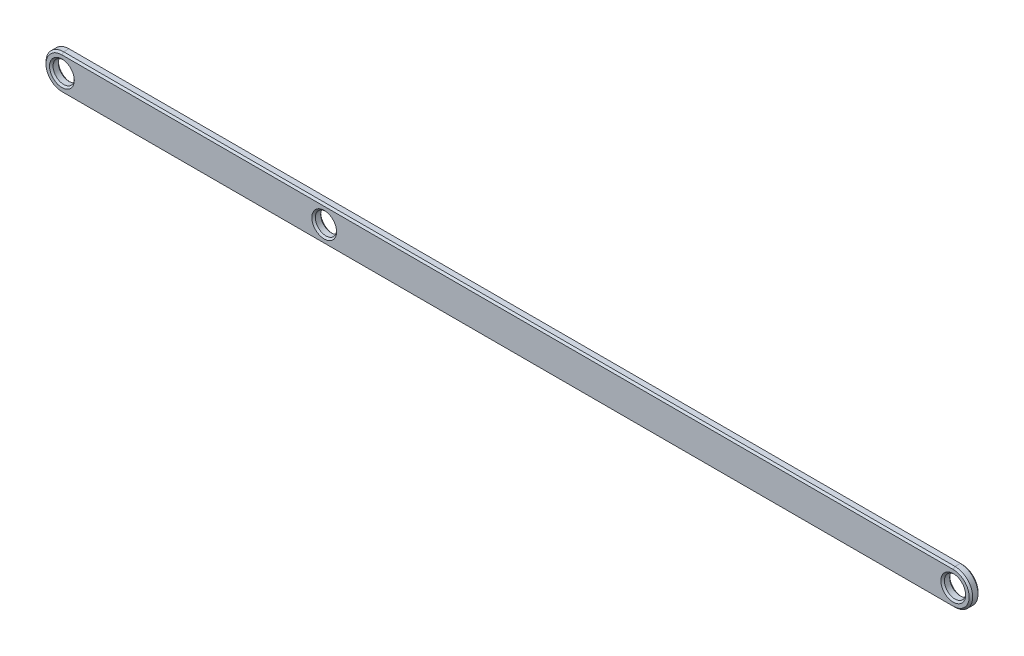
ISO-10303-21;
HEADER;
FILE_DESCRIPTION(('STEP AP214'),'2;1');
FILE_NAME('part.step','',(''),(''),'','','');
FILE_SCHEMA(('AUTOMOTIVE_DESIGN { 1 0 10303 214 1 1 1 1 }'));
ENDSEC;
DATA;
#1=APPLICATION_CONTEXT('core data for automotive mechanical design processes');
#2=APPLICATION_PROTOCOL_DEFINITION('international standard','automotive_design',2000,#1);
#3=PRODUCT_CONTEXT('',#1,'mechanical');
#4=PRODUCT('Part','Part','',(#3));
#5=PRODUCT_RELATED_PRODUCT_CATEGORY('part','',(#4));
#6=PRODUCT_DEFINITION_FORMATION('','',#4);
#7=PRODUCT_DEFINITION_CONTEXT('part definition',#1,'design');
#8=PRODUCT_DEFINITION('design','',#6,#7);
#9=PRODUCT_DEFINITION_SHAPE('','',#8);
#10=(LENGTH_UNIT() NAMED_UNIT(*) SI_UNIT(.MILLI.,.METRE.));
#11=(NAMED_UNIT(*) PLANE_ANGLE_UNIT() SI_UNIT($,.RADIAN.));
#12=(NAMED_UNIT(*) SI_UNIT($,.STERADIAN.) SOLID_ANGLE_UNIT());
#13=UNCERTAINTY_MEASURE_WITH_UNIT(LENGTH_MEASURE(1.E-05),#10,'distance_accuracy_value','');
#14=(GEOMETRIC_REPRESENTATION_CONTEXT(3) GLOBAL_UNCERTAINTY_ASSIGNED_CONTEXT((#13)) GLOBAL_UNIT_ASSIGNED_CONTEXT((#10,
#11,#12)) REPRESENTATION_CONTEXT('',''));
#15=CARTESIAN_POINT('',(0.,0.,0.));
#16=DIRECTION('',(0.,0.,1.));
#17=DIRECTION('',(1.,0.,0.));
#18=AXIS2_PLACEMENT_3D('',#15,#16,#17);
#19=CARTESIAN_POINT('',(-1260.,0.,25.));
#20=DIRECTION('',(0.,0.,1.));
#21=DIRECTION('',(1.,0.,0.));
#22=AXIS2_PLACEMENT_3D('',#19,#20,#21);
#23=PLANE('',#22);
#24=CARTESIAN_POINT('',(-518.4,0.,25.));
#25=DIRECTION('',(0.,0.,1.));
#26=DIRECTION('',(1.,0.,0.));
#27=AXIS2_PLACEMENT_3D('',#24,#25,#26);
#28=CIRCLE('',#27,35.0000000000001);
#29=CARTESIAN_POINT('',(-483.4,0.,25.));
#30=VERTEX_POINT('',#29);
#31=EDGE_CURVE('E11',#30,#30,#28,.F.);
#32=ORIENTED_EDGE('',*,*,#31,.T.);
#33=EDGE_LOOP('',(#32));
#34=FACE_BOUND('',#33,.T.);
#35=CARTESIAN_POINT('',(-1260.,0.,25.));
#36=DIRECTION('',(0.,0.,1.));
#37=DIRECTION('',(1.,0.,0.));
#38=AXIS2_PLACEMENT_3D('',#35,#36,#37);
#39=CIRCLE('',#38,35.0000000000001);
#40=CARTESIAN_POINT('',(-1225.,0.,25.));
#41=VERTEX_POINT('',#40);
#42=EDGE_CURVE('E42',#41,#41,#39,.F.);
#43=ORIENTED_EDGE('',*,*,#42,.T.);
#44=EDGE_LOOP('',(#43));
#45=FACE_BOUND('',#44,.T.);
#46=CARTESIAN_POINT('',(1260.,3.08610993385133E-13,25.));
#47=DIRECTION('',(0.,0.,1.));
#48=DIRECTION('',(1.,0.,0.));
#49=AXIS2_PLACEMENT_3D('',#46,#47,#48);
#50=CIRCLE('',#49,45.0000000000001);
#51=CARTESIAN_POINT('',(1260.,-44.9999999999999,25.));
#52=VERTEX_POINT('',#51);
#53=CARTESIAN_POINT('',(1260.,45.0000000000005,25.));
#54=VERTEX_POINT('',#53);
#55=EDGE_CURVE('E50',#52,#54,#50,.T.);
#56=ORIENTED_EDGE('',*,*,#55,.T.);
#57=DIRECTION('',(-1.,0.,0.));
#58=VECTOR('',#57,1.);
#59=CARTESIAN_POINT('',(-1260.,45.0000000000001,25.));
#60=LINE('',#59,#58);
#61=CARTESIAN_POINT('',(-1260.,45.0000000000001,25.));
#62=VERTEX_POINT('',#61);
#63=EDGE_CURVE('E181',#54,#62,#60,.T.);
#64=ORIENTED_EDGE('',*,*,#63,.T.);
#65=CARTESIAN_POINT('',(-1260.,0.,25.));
#66=DIRECTION('',(0.,0.,1.));
#67=DIRECTION('',(1.,0.,0.));
#68=AXIS2_PLACEMENT_3D('',#65,#66,#67);
#69=CIRCLE('',#68,45.0000000000001);
#70=CARTESIAN_POINT('',(-1260.,-45.0000000000001,25.));
#71=VERTEX_POINT('',#70);
#72=EDGE_CURVE('E177',#62,#71,#69,.T.);
#73=ORIENTED_EDGE('',*,*,#72,.T.);
#74=DIRECTION('',(1.,0.,0.));
#75=VECTOR('',#74,1.);
#76=CARTESIAN_POINT('',(1260.,-44.9999999999999,25.));
#77=LINE('',#76,#75);
#78=EDGE_CURVE('E55',#71,#52,#77,.T.);
#79=ORIENTED_EDGE('',*,*,#78,.T.);
#80=EDGE_LOOP('',(#56,#64,#73,#79));
#81=FACE_BOUND('',#80,.T.);
#82=CARTESIAN_POINT('',(1260.,3.08610993385133E-13,25.));
#83=DIRECTION('',(0.,0.,1.));
#84=DIRECTION('',(1.,0.,0.));
#85=AXIS2_PLACEMENT_3D('',#82,#83,#84);
#86=CIRCLE('',#85,35.0000000000001);
#87=CARTESIAN_POINT('',(1295.,3.08610993385133E-13,25.));
#88=VERTEX_POINT('',#87);
#89=EDGE_CURVE('E174',#88,#88,#86,.F.);
#90=ORIENTED_EDGE('',*,*,#89,.T.);
#91=EDGE_LOOP('',(#90));
#92=FACE_BOUND('',#91,.T.);
#93=ADVANCED_FACE('F33',(#34,#45,#81,#92),#23,.T.);
#94=CARTESIAN_POINT('',(-1260.,0.,0.));
#95=DIRECTION('',(0.,0.,1.));
#96=DIRECTION('',(1.,0.,0.));
#97=AXIS2_PLACEMENT_3D('',#94,#95,#96);
#98=PLANE('',#97);
#99=CARTESIAN_POINT('',(-518.4,0.,0.));
#100=DIRECTION('',(0.,0.,1.));
#101=DIRECTION('',(1.,0.,0.));
#102=AXIS2_PLACEMENT_3D('',#99,#100,#101);
#103=CIRCLE('',#102,34.9999999999999);
#104=CARTESIAN_POINT('',(-483.4,0.,0.));
#105=VERTEX_POINT('',#104);
#106=EDGE_CURVE('E137',#105,#105,#103,.T.);
#107=ORIENTED_EDGE('',*,*,#106,.T.);
#108=EDGE_LOOP('',(#107));
#109=FACE_BOUND('',#108,.T.);
#110=CARTESIAN_POINT('',(1260.,3.08610993385133E-13,0.));
#111=DIRECTION('',(0.,0.,1.));
#112=DIRECTION('',(1.,0.,0.));
#113=AXIS2_PLACEMENT_3D('',#110,#111,#112);
#114=CIRCLE('',#113,34.9999999999999);
#115=CARTESIAN_POINT('',(1295.,3.08610993385133E-13,0.));
#116=VERTEX_POINT('',#115);
#117=EDGE_CURVE('E130',#116,#116,#114,.T.);
#118=ORIENTED_EDGE('',*,*,#117,.T.);
#119=EDGE_LOOP('',(#118));
#120=FACE_BOUND('',#119,.T.);
#121=CARTESIAN_POINT('',(-1260.,0.,0.));
#122=DIRECTION('',(0.,0.,1.));
#123=DIRECTION('',(1.,0.,0.));
#124=AXIS2_PLACEMENT_3D('',#121,#122,#123);
#125=CIRCLE('',#124,34.9999999999999);
#126=CARTESIAN_POINT('',(-1225.,0.,0.));
#127=VERTEX_POINT('',#126);
#128=EDGE_CURVE('E127',#127,#127,#125,.T.);
#129=ORIENTED_EDGE('',*,*,#128,.T.);
#130=EDGE_LOOP('',(#129));
#131=FACE_BOUND('',#130,.T.);
#132=CARTESIAN_POINT('',(1260.,3.08610993385133E-13,0.));
#133=DIRECTION('',(0.,0.,1.));
#134=DIRECTION('',(1.,0.,0.));
#135=AXIS2_PLACEMENT_3D('',#132,#133,#134);
#136=CIRCLE('',#135,45.0000000000001);
#137=CARTESIAN_POINT('',(1260.,45.0000000000005,0.));
#138=VERTEX_POINT('',#137);
#139=CARTESIAN_POINT('',(1260.,-44.9999999999998,0.));
#140=VERTEX_POINT('',#139);
#141=EDGE_CURVE('E126',#138,#140,#136,.F.);
#142=ORIENTED_EDGE('',*,*,#141,.T.);
#143=DIRECTION('',(-1.,0.,0.));
#144=VECTOR('',#143,1.);
#145=CARTESIAN_POINT('',(-1260.,-45.0000000000002,0.));
#146=LINE('',#145,#144);
#147=CARTESIAN_POINT('',(-1260.,-45.0000000000001,0.));
#148=VERTEX_POINT('',#147);
#149=EDGE_CURVE('E105',#140,#148,#146,.T.);
#150=ORIENTED_EDGE('',*,*,#149,.T.);
#151=CARTESIAN_POINT('',(-1260.,0.,0.));
#152=DIRECTION('',(0.,0.,1.));
#153=DIRECTION('',(1.,0.,0.));
#154=AXIS2_PLACEMENT_3D('',#151,#152,#153);
#155=CIRCLE('',#154,45.0000000000001);
#156=CARTESIAN_POINT('',(-1260.,45.0000000000001,0.));
#157=VERTEX_POINT('',#156);
#158=EDGE_CURVE('E115',#148,#157,#155,.F.);
#159=ORIENTED_EDGE('',*,*,#158,.T.);
#160=DIRECTION('',(1.,0.,0.));
#161=VECTOR('',#160,1.);
#162=CARTESIAN_POINT('',(-1260.,45.0000000000001,0.));
#163=LINE('',#162,#161);
#164=EDGE_CURVE('E121',#157,#138,#163,.T.);
#165=ORIENTED_EDGE('',*,*,#164,.T.);
#166=EDGE_LOOP('',(#142,#150,#159,#165));
#167=FACE_BOUND('',#166,.T.);
#168=ADVANCED_FACE('F124',(#109,#120,#131,#167),#98,.F.);
#169=CARTESIAN_POINT('',(-1260.,0.,25.));
#170=DIRECTION('',(0.,0.,-1.));
#171=DIRECTION('',(-1.,0.,0.));
#172=AXIS2_PLACEMENT_3D('',#169,#170,#171);
#173=CYLINDRICAL_SURFACE('',#172,50.);
#174=DIRECTION('',(0.,0.,-1.));
#175=VECTOR('',#174,1.);
#176=CARTESIAN_POINT('',(-1260.,50.,25.));
#177=LINE('',#176,#175);
#178=CARTESIAN_POINT('',(-1260.,50.,20.0000000000001));
#179=VERTEX_POINT('',#178);
#180=CARTESIAN_POINT('',(-1260.,50.,4.99999999999994));
#181=VERTEX_POINT('',#180);
#182=EDGE_CURVE('E189',#179,#181,#177,.T.);
#183=ORIENTED_EDGE('',*,*,#182,.T.);
#184=CARTESIAN_POINT('',(-1260.,0.,4.99999999999994));
#185=DIRECTION('',(0.,0.,1.));
#186=DIRECTION('',(1.,0.,0.));
#187=AXIS2_PLACEMENT_3D('',#184,#185,#186);
#188=CIRCLE('',#187,50.);
#189=CARTESIAN_POINT('',(-1260.,-50.,4.99999999999994));
#190=VERTEX_POINT('',#189);
#191=EDGE_CURVE('E172',#181,#190,#188,.T.);
#192=ORIENTED_EDGE('',*,*,#191,.T.);
#193=DIRECTION('',(0.,0.,-1.));
#194=VECTOR('',#193,1.);
#195=CARTESIAN_POINT('',(-1260.,-50.,25.));
#196=LINE('',#195,#194);
#197=CARTESIAN_POINT('',(-1260.,-50.,20.0000000000001));
#198=VERTEX_POINT('',#197);
#199=EDGE_CURVE('E122',#198,#190,#196,.T.);
#200=ORIENTED_EDGE('',*,*,#199,.F.);
#201=CARTESIAN_POINT('',(-1260.,0.,20.0000000000001));
#202=DIRECTION('',(0.,0.,1.));
#203=DIRECTION('',(1.,0.,0.));
#204=AXIS2_PLACEMENT_3D('',#201,#202,#203);
#205=CIRCLE('',#204,50.);
#206=EDGE_CURVE('E170',#198,#179,#205,.F.);
#207=ORIENTED_EDGE('',*,*,#206,.T.);
#208=EDGE_LOOP('',(#183,#192,#200,#207));
#209=FACE_BOUND('',#208,.T.);
#210=ADVANCED_FACE('F215',(#209),#173,.T.);
#211=CARTESIAN_POINT('',(1260.,-49.9999999999997,25.));
#212=DIRECTION('',(0.,1.,0.));
#213=DIRECTION('',(-1.,0.,0.));
#214=AXIS2_PLACEMENT_3D('',#211,#212,#213);
#215=PLANE('',#214);
#216=ORIENTED_EDGE('',*,*,#199,.T.);
#217=DIRECTION('',(1.,0.,0.));
#218=VECTOR('',#217,1.);
#219=CARTESIAN_POINT('',(1260.,-49.9999999999997,4.99999999999994));
#220=LINE('',#219,#218);
#221=CARTESIAN_POINT('',(1260.,-49.9999999999997,4.99999999999994));
#222=VERTEX_POINT('',#221);
#223=EDGE_CURVE('E108',#190,#222,#220,.T.);
#224=ORIENTED_EDGE('',*,*,#223,.T.);
#225=DIRECTION('',(0.,0.,-1.));
#226=VECTOR('',#225,1.);
#227=CARTESIAN_POINT('',(1260.,-49.9999999999997,25.));
#228=LINE('',#227,#226);
#229=CARTESIAN_POINT('',(1260.,-49.9999999999997,20.0000000000001));
#230=VERTEX_POINT('',#229);
#231=EDGE_CURVE('E212',#230,#222,#228,.T.);
#232=ORIENTED_EDGE('',*,*,#231,.F.);
#233=DIRECTION('',(-1.,0.,0.));
#234=VECTOR('',#233,1.);
#235=CARTESIAN_POINT('',(-1260.,-50.,20.0000000000001));
#236=LINE('',#235,#234);
#237=EDGE_CURVE('E158',#230,#198,#236,.T.);
#238=ORIENTED_EDGE('',*,*,#237,.T.);
#239=EDGE_LOOP('',(#216,#224,#232,#238));
#240=FACE_BOUND('',#239,.T.);
#241=ADVANCED_FACE('F210',(#240),#215,.F.);
#242=CARTESIAN_POINT('',(1260.,3.08610993385133E-13,25.));
#243=DIRECTION('',(0.,0.,-1.));
#244=DIRECTION('',(-1.,0.,0.));
#245=AXIS2_PLACEMENT_3D('',#242,#243,#244);
#246=CYLINDRICAL_SURFACE('',#245,50.);
#247=ORIENTED_EDGE('',*,*,#231,.T.);
#248=CARTESIAN_POINT('',(1260.,3.08610993385133E-13,4.99999999999994));
#249=DIRECTION('',(0.,0.,1.));
#250=DIRECTION('',(1.,0.,0.));
#251=AXIS2_PLACEMENT_3D('',#248,#249,#250);
#252=CIRCLE('',#251,50.);
#253=CARTESIAN_POINT('',(1260.,50.0000000000003,4.99999999999994));
#254=VERTEX_POINT('',#253);
#255=EDGE_CURVE('E163',#222,#254,#252,.T.);
#256=ORIENTED_EDGE('',*,*,#255,.T.);
#257=DIRECTION('',(0.,0.,-1.));
#258=VECTOR('',#257,1.);
#259=CARTESIAN_POINT('',(1260.,50.0000000000003,25.));
#260=LINE('',#259,#258);
#261=CARTESIAN_POINT('',(1260.,50.0000000000003,20.0000000000001));
#262=VERTEX_POINT('',#261);
#263=EDGE_CURVE('E218',#262,#254,#260,.T.);
#264=ORIENTED_EDGE('',*,*,#263,.F.);
#265=CARTESIAN_POINT('',(1260.,3.08610993385133E-13,20.0000000000001));
#266=DIRECTION('',(0.,0.,1.));
#267=DIRECTION('',(1.,0.,0.));
#268=AXIS2_PLACEMENT_3D('',#265,#266,#267);
#269=CIRCLE('',#268,50.);
#270=EDGE_CURVE('E161',#262,#230,#269,.F.);
#271=ORIENTED_EDGE('',*,*,#270,.T.);
#272=EDGE_LOOP('',(#247,#256,#264,#271));
#273=FACE_BOUND('',#272,.T.);
#274=ADVANCED_FACE('F231',(#273),#246,.T.);
#275=CARTESIAN_POINT('',(1260.,50.0000000000003,25.));
#276=DIRECTION('',(0.,-1.,0.));
#277=DIRECTION('',(1.,0.,0.));
#278=AXIS2_PLACEMENT_3D('',#275,#276,#277);
#279=PLANE('',#278);
#280=ORIENTED_EDGE('',*,*,#263,.T.);
#281=DIRECTION('',(-1.,0.,0.));
#282=VECTOR('',#281,1.);
#283=CARTESIAN_POINT('',(1260.,50.0000000000003,4.99999999999994));
#284=LINE('',#283,#282);
#285=EDGE_CURVE('E168',#254,#181,#284,.T.);
#286=ORIENTED_EDGE('',*,*,#285,.T.);
#287=ORIENTED_EDGE('',*,*,#182,.F.);
#288=DIRECTION('',(1.,0.,0.));
#289=VECTOR('',#288,1.);
#290=CARTESIAN_POINT('',(1260.,50.0000000000003,20.0000000000001));
#291=LINE('',#290,#289);
#292=EDGE_CURVE('E165',#179,#262,#291,.T.);
#293=ORIENTED_EDGE('',*,*,#292,.T.);
#294=EDGE_LOOP('',(#280,#286,#287,#293));
#295=FACE_BOUND('',#294,.T.);
#296=ADVANCED_FACE('F235',(#295),#279,.F.);
#297=CARTESIAN_POINT('',(-1260.,0.,25.));
#298=DIRECTION('',(0.,0.,-1.));
#299=DIRECTION('',(-1.,0.,0.));
#300=AXIS2_PLACEMENT_3D('',#297,#298,#299);
#301=CYLINDRICAL_SURFACE('',#300,30.);
#302=CARTESIAN_POINT('',(-1260.,0.,4.99999999999997));
#303=DIRECTION('',(0.,0.,1.));
#304=DIRECTION('',(1.,0.,0.));
#305=AXIS2_PLACEMENT_3D('',#302,#303,#304);
#306=CIRCLE('',#305,30.);
#307=CARTESIAN_POINT('',(-1230.,0.,4.99999999999997));
#308=VERTEX_POINT('',#307);
#309=EDGE_CURVE('E155',#308,#308,#306,.F.);
#310=ORIENTED_EDGE('',*,*,#309,.T.);
#311=EDGE_LOOP('',(#310));
#312=FACE_BOUND('',#311,.T.);
#313=CARTESIAN_POINT('',(-1260.,0.,19.9999999999998));
#314=DIRECTION('',(0.,0.,1.));
#315=DIRECTION('',(1.,0.,0.));
#316=AXIS2_PLACEMENT_3D('',#313,#314,#315);
#317=CIRCLE('',#316,30.);
#318=CARTESIAN_POINT('',(-1230.,0.,19.9999999999998));
#319=VERTEX_POINT('',#318);
#320=EDGE_CURVE('E152',#319,#319,#317,.T.);
#321=ORIENTED_EDGE('',*,*,#320,.T.);
#322=EDGE_LOOP('',(#321));
#323=FACE_BOUND('',#322,.T.);
#324=ADVANCED_FACE('F254',(#312,#323),#301,.F.);
#325=CARTESIAN_POINT('',(1260.,3.08610993385133E-13,25.));
#326=DIRECTION('',(0.,0.,-1.));
#327=DIRECTION('',(-1.,0.,0.));
#328=AXIS2_PLACEMENT_3D('',#325,#326,#327);
#329=CYLINDRICAL_SURFACE('',#328,30.);
#330=CARTESIAN_POINT('',(1260.,3.08610993385133E-13,4.99999999999997));
#331=DIRECTION('',(0.,0.,1.));
#332=DIRECTION('',(1.,0.,0.));
#333=AXIS2_PLACEMENT_3D('',#330,#331,#332);
#334=CIRCLE('',#333,30.);
#335=CARTESIAN_POINT('',(1290.,3.08610993385133E-13,4.99999999999997));
#336=VERTEX_POINT('',#335);
#337=EDGE_CURVE('E149',#336,#336,#334,.F.);
#338=ORIENTED_EDGE('',*,*,#337,.T.);
#339=EDGE_LOOP('',(#338));
#340=FACE_BOUND('',#339,.T.);
#341=CARTESIAN_POINT('',(1260.,3.08610993385133E-13,19.9999999999998));
#342=DIRECTION('',(0.,0.,1.));
#343=DIRECTION('',(1.,0.,0.));
#344=AXIS2_PLACEMENT_3D('',#341,#342,#343);
#345=CIRCLE('',#344,30.);
#346=CARTESIAN_POINT('',(1290.,3.08610993385133E-13,19.9999999999998));
#347=VERTEX_POINT('',#346);
#348=EDGE_CURVE('E146',#347,#347,#345,.T.);
#349=ORIENTED_EDGE('',*,*,#348,.T.);
#350=EDGE_LOOP('',(#349));
#351=FACE_BOUND('',#350,.T.);
#352=ADVANCED_FACE('F251',(#340,#351),#329,.F.);
#353=CARTESIAN_POINT('',(-518.4,0.,25.));
#354=DIRECTION('',(0.,0.,-1.));
#355=DIRECTION('',(-1.,0.,0.));
#356=AXIS2_PLACEMENT_3D('',#353,#354,#355);
#357=CYLINDRICAL_SURFACE('',#356,30.);
#358=CARTESIAN_POINT('',(-518.4,0.,4.99999999999997));
#359=DIRECTION('',(0.,0.,1.));
#360=DIRECTION('',(1.,0.,0.));
#361=AXIS2_PLACEMENT_3D('',#358,#359,#360);
#362=CIRCLE('',#361,30.);
#363=CARTESIAN_POINT('',(-488.4,0.,4.99999999999997));
#364=VERTEX_POINT('',#363);
#365=EDGE_CURVE('E143',#364,#364,#362,.F.);
#366=ORIENTED_EDGE('',*,*,#365,.T.);
#367=EDGE_LOOP('',(#366));
#368=FACE_BOUND('',#367,.T.);
#369=CARTESIAN_POINT('',(-518.4,0.,19.9999999999998));
#370=DIRECTION('',(0.,0.,1.));
#371=DIRECTION('',(1.,0.,0.));
#372=AXIS2_PLACEMENT_3D('',#369,#370,#371);
#373=CIRCLE('',#372,30.);
#374=CARTESIAN_POINT('',(-488.4,0.,19.9999999999998));
#375=VERTEX_POINT('',#374);
#376=EDGE_CURVE('E140',#375,#375,#373,.T.);
#377=ORIENTED_EDGE('',*,*,#376,.T.);
#378=EDGE_LOOP('',(#377));
#379=FACE_BOUND('',#378,.T.);
#380=ADVANCED_FACE('F253',(#368,#379),#357,.F.);
#381=CARTESIAN_POINT('',(-518.4,0.,0.));
#382=DIRECTION('',(0.,0.,-1.));
#383=DIRECTION('',(-1.,0.,0.));
#384=AXIS2_PLACEMENT_3D('',#381,#382,#383);
#385=CONICAL_SURFACE('',#384,34.9999999999999,0.785398163397438);
#386=ORIENTED_EDGE('',*,*,#365,.F.);
#387=EDGE_LOOP('',(#386));
#388=FACE_BOUND('',#387,.T.);
#389=ORIENTED_EDGE('',*,*,#106,.F.);
#390=EDGE_LOOP('',(#389));
#391=FACE_BOUND('',#390,.T.);
#392=ADVANCED_FACE('F261',(#388,#391),#385,.F.);
#393=CARTESIAN_POINT('',(1260.,3.08610993385133E-13,0.));
#394=DIRECTION('',(0.,0.,-1.));
#395=DIRECTION('',(-1.,0.,0.));
#396=AXIS2_PLACEMENT_3D('',#393,#394,#395);
#397=CONICAL_SURFACE('',#396,34.9999999999999,0.785398163397438);
#398=ORIENTED_EDGE('',*,*,#337,.F.);
#399=EDGE_LOOP('',(#398));
#400=FACE_BOUND('',#399,.T.);
#401=ORIENTED_EDGE('',*,*,#117,.F.);
#402=EDGE_LOOP('',(#401));
#403=FACE_BOUND('',#402,.T.);
#404=ADVANCED_FACE('F280',(#400,#403),#397,.F.);
#405=CARTESIAN_POINT('',(-1260.,0.,0.));
#406=DIRECTION('',(0.,0.,-1.));
#407=DIRECTION('',(-1.,0.,0.));
#408=AXIS2_PLACEMENT_3D('',#405,#406,#407);
#409=CONICAL_SURFACE('',#408,34.9999999999999,0.785398163397438);
#410=ORIENTED_EDGE('',*,*,#309,.F.);
#411=EDGE_LOOP('',(#410));
#412=FACE_BOUND('',#411,.T.);
#413=ORIENTED_EDGE('',*,*,#128,.F.);
#414=EDGE_LOOP('',(#413));
#415=FACE_BOUND('',#414,.T.);
#416=ADVANCED_FACE('F284',(#412,#415),#409,.F.);
#417=CARTESIAN_POINT('',(1260.,50.0000000000003,4.99999999999994));
#418=DIRECTION('',(0.,-0.707106781186551,0.707106781186544));
#419=DIRECTION('',(-1.,0.,0.));
#420=AXIS2_PLACEMENT_3D('',#417,#418,#419);
#421=PLANE('',#420);
#422=DIRECTION('',(0.,0.707106781186544,0.707106781186551));
#423=VECTOR('',#422,1.);
#424=CARTESIAN_POINT('',(1260.,45.0000000000005,0.));
#425=LINE('',#424,#423);
#426=EDGE_CURVE('E111',#138,#254,#425,.T.);
#427=ORIENTED_EDGE('',*,*,#426,.F.);
#428=ORIENTED_EDGE('',*,*,#164,.F.);
#429=DIRECTION('',(0.,-0.707106781186544,-0.707106781186551));
#430=VECTOR('',#429,1.);
#431=CARTESIAN_POINT('',(-1260.,50.,4.99999999999994));
#432=LINE('',#431,#430);
#433=EDGE_CURVE('E118',#181,#157,#432,.T.);
#434=ORIENTED_EDGE('',*,*,#433,.F.);
#435=ORIENTED_EDGE('',*,*,#285,.F.);
#436=EDGE_LOOP('',(#427,#428,#434,#435));
#437=FACE_BOUND('',#436,.T.);
#438=ADVANCED_FACE('F224',(#437),#421,.F.);
#439=CARTESIAN_POINT('',(-1260.,0.,4.99999999999994));
#440=DIRECTION('',(0.,0.,1.));
#441=DIRECTION('',(1.,0.,0.));
#442=AXIS2_PLACEMENT_3D('',#439,#440,#441);
#443=CONICAL_SURFACE('',#442,50.,0.785398163397443);
#444=ORIENTED_EDGE('',*,*,#433,.T.);
#445=ORIENTED_EDGE('',*,*,#158,.F.);
#446=DIRECTION('',(0.,0.707106781186544,-0.707106781186551));
#447=VECTOR('',#446,1.);
#448=CARTESIAN_POINT('',(-1260.,-50.,4.99999999999994));
#449=LINE('',#448,#447);
#450=EDGE_CURVE('E101',#190,#148,#449,.T.);
#451=ORIENTED_EDGE('',*,*,#450,.F.);
#452=ORIENTED_EDGE('',*,*,#191,.F.);
#453=EDGE_LOOP('',(#444,#445,#451,#452));
#454=FACE_BOUND('',#453,.T.);
#455=ADVANCED_FACE('F116',(#454),#443,.T.);
#456=CARTESIAN_POINT('',(1260.,3.08610993385133E-13,4.99999999999994));
#457=DIRECTION('',(0.,0.,1.));
#458=DIRECTION('',(1.,0.,0.));
#459=AXIS2_PLACEMENT_3D('',#456,#457,#458);
#460=CONICAL_SURFACE('',#459,50.,0.785398163397443);
#461=ORIENTED_EDGE('',*,*,#426,.T.);
#462=ORIENTED_EDGE('',*,*,#255,.F.);
#463=DIRECTION('',(0.,-0.707106781186544,0.707106781186551));
#464=VECTOR('',#463,1.);
#465=CARTESIAN_POINT('',(1260.,-44.9999999999998,0.));
#466=LINE('',#465,#464);
#467=EDGE_CURVE('E112',#140,#222,#466,.T.);
#468=ORIENTED_EDGE('',*,*,#467,.F.);
#469=ORIENTED_EDGE('',*,*,#141,.F.);
#470=EDGE_LOOP('',(#461,#462,#468,#469));
#471=FACE_BOUND('',#470,.T.);
#472=ADVANCED_FACE('F227',(#471),#460,.T.);
#473=CARTESIAN_POINT('',(1260.,-49.9999999999997,4.99999999999994));
#474=DIRECTION('',(0.,0.707106781186551,0.707106781186544));
#475=DIRECTION('',(1.,0.,0.));
#476=AXIS2_PLACEMENT_3D('',#473,#474,#475);
#477=PLANE('',#476);
#478=ORIENTED_EDGE('',*,*,#450,.T.);
#479=ORIENTED_EDGE('',*,*,#149,.F.);
#480=ORIENTED_EDGE('',*,*,#467,.T.);
#481=ORIENTED_EDGE('',*,*,#223,.F.);
#482=EDGE_LOOP('',(#478,#479,#480,#481));
#483=FACE_BOUND('',#482,.T.);
#484=ADVANCED_FACE('F103',(#483),#477,.F.);
#485=CARTESIAN_POINT('',(-518.4,0.,19.9999999999998));
#486=DIRECTION('',(0.,0.,1.));
#487=DIRECTION('',(1.,0.,0.));
#488=AXIS2_PLACEMENT_3D('',#485,#486,#487);
#489=CONICAL_SURFACE('',#488,30.,0.785398163397438);
#490=ORIENTED_EDGE('',*,*,#31,.F.);
#491=EDGE_LOOP('',(#490));
#492=FACE_BOUND('',#491,.T.);
#493=ORIENTED_EDGE('',*,*,#376,.F.);
#494=EDGE_LOOP('',(#493));
#495=FACE_BOUND('',#494,.T.);
#496=ADVANCED_FACE('F291',(#492,#495),#489,.F.);
#497=CARTESIAN_POINT('',(-1260.,0.,19.9999999999998));
#498=DIRECTION('',(0.,0.,1.));
#499=DIRECTION('',(1.,0.,0.));
#500=AXIS2_PLACEMENT_3D('',#497,#498,#499);
#501=CONICAL_SURFACE('',#500,30.,0.785398163397438);
#502=ORIENTED_EDGE('',*,*,#42,.F.);
#503=EDGE_LOOP('',(#502));
#504=FACE_BOUND('',#503,.T.);
#505=ORIENTED_EDGE('',*,*,#320,.F.);
#506=EDGE_LOOP('',(#505));
#507=FACE_BOUND('',#506,.T.);
#508=ADVANCED_FACE('F300',(#504,#507),#501,.F.);
#509=CARTESIAN_POINT('',(-1260.,-45.0000000000002,25.));
#510=DIRECTION('',(0.,-0.707106781186551,0.707106781186544));
#511=DIRECTION('',(-1.,0.,0.));
#512=AXIS2_PLACEMENT_3D('',#509,#510,#511);
#513=PLANE('',#512);
#514=DIRECTION('',(0.,0.707106781186544,0.707106781186551));
#515=VECTOR('',#514,1.);
#516=CARTESIAN_POINT('',(-1260.,-50.,20.0000000000001));
#517=LINE('',#516,#515);
#518=EDGE_CURVE('E193',#198,#71,#517,.T.);
#519=ORIENTED_EDGE('',*,*,#518,.F.);
#520=ORIENTED_EDGE('',*,*,#237,.F.);
#521=DIRECTION('',(0.,-0.707106781186544,-0.707106781186551));
#522=VECTOR('',#521,1.);
#523=CARTESIAN_POINT('',(1260.,-44.9999999999999,25.));
#524=LINE('',#523,#522);
#525=EDGE_CURVE('E37',#52,#230,#524,.T.);
#526=ORIENTED_EDGE('',*,*,#525,.F.);
#527=ORIENTED_EDGE('',*,*,#78,.F.);
#528=EDGE_LOOP('',(#519,#520,#526,#527));
#529=FACE_BOUND('',#528,.T.);
#530=ADVANCED_FACE('F205',(#529),#513,.T.);
#531=CARTESIAN_POINT('',(1260.,3.08610993385133E-13,25.));
#532=DIRECTION('',(0.,0.,-1.));
#533=DIRECTION('',(-1.,0.,0.));
#534=AXIS2_PLACEMENT_3D('',#531,#532,#533);
#535=CONICAL_SURFACE('',#534,45.0000000000001,0.785398163397443);
#536=ORIENTED_EDGE('',*,*,#525,.T.);
#537=ORIENTED_EDGE('',*,*,#270,.F.);
#538=DIRECTION('',(0.,0.707106781186544,-0.707106781186551));
#539=VECTOR('',#538,1.);
#540=CARTESIAN_POINT('',(1260.,45.0000000000005,25.));
#541=LINE('',#540,#539);
#542=EDGE_CURVE('E192',#54,#262,#541,.T.);
#543=ORIENTED_EDGE('',*,*,#542,.F.);
#544=ORIENTED_EDGE('',*,*,#55,.F.);
#545=EDGE_LOOP('',(#536,#537,#543,#544));
#546=FACE_BOUND('',#545,.T.);
#547=ADVANCED_FACE('F202',(#546),#535,.T.);
#548=CARTESIAN_POINT('',(-1260.,0.,25.));
#549=DIRECTION('',(0.,0.,-1.));
#550=DIRECTION('',(-1.,0.,0.));
#551=AXIS2_PLACEMENT_3D('',#548,#549,#550);
#552=CONICAL_SURFACE('',#551,45.0000000000001,0.785398163397443);
#553=ORIENTED_EDGE('',*,*,#518,.T.);
#554=ORIENTED_EDGE('',*,*,#72,.F.);
#555=DIRECTION('',(0.,-0.707106781186544,0.707106781186551));
#556=VECTOR('',#555,1.);
#557=CARTESIAN_POINT('',(-1260.,50.,20.0000000000001));
#558=LINE('',#557,#556);
#559=EDGE_CURVE('E190',#179,#62,#558,.T.);
#560=ORIENTED_EDGE('',*,*,#559,.F.);
#561=ORIENTED_EDGE('',*,*,#206,.F.);
#562=EDGE_LOOP('',(#553,#554,#560,#561));
#563=FACE_BOUND('',#562,.T.);
#564=ADVANCED_FACE('F240',(#563),#552,.T.);
#565=CARTESIAN_POINT('',(-1260.,45.0000000000001,25.));
#566=DIRECTION('',(0.,0.707106781186551,0.707106781186544));
#567=DIRECTION('',(1.,0.,0.));
#568=AXIS2_PLACEMENT_3D('',#565,#566,#567);
#569=PLANE('',#568);
#570=ORIENTED_EDGE('',*,*,#542,.T.);
#571=ORIENTED_EDGE('',*,*,#292,.F.);
#572=ORIENTED_EDGE('',*,*,#559,.T.);
#573=ORIENTED_EDGE('',*,*,#63,.F.);
#574=EDGE_LOOP('',(#570,#571,#572,#573));
#575=FACE_BOUND('',#574,.T.);
#576=ADVANCED_FACE('F238',(#575),#569,.T.);
#577=CARTESIAN_POINT('',(1260.,3.08610993385133E-13,19.9999999999998));
#578=DIRECTION('',(0.,0.,1.));
#579=DIRECTION('',(1.,0.,0.));
#580=AXIS2_PLACEMENT_3D('',#577,#578,#579);
#581=CONICAL_SURFACE('',#580,30.,0.785398163397438);
#582=ORIENTED_EDGE('',*,*,#89,.F.);
#583=EDGE_LOOP('',(#582));
#584=FACE_BOUND('',#583,.T.);
#585=ORIENTED_EDGE('',*,*,#348,.F.);
#586=EDGE_LOOP('',(#585));
#587=FACE_BOUND('',#586,.T.);
#588=ADVANCED_FACE('F35',(#584,#587),#581,.F.);
#589=CLOSED_SHELL('',(#93,#168,#210,#241,#274,#296,#324,#352,#380,#392,#404,#416,#438,#455,#472,
#484,#496,#508,#530,#547,#564,#576,#588));
#590=MANIFOLD_SOLID_BREP('B2',#589);
#591=ADVANCED_BREP_SHAPE_REPRESENTATION('',(#18,#590),#14);
#592=SHAPE_DEFINITION_REPRESENTATION(#9,#591);
ENDSEC;
END-ISO-10303-21;
